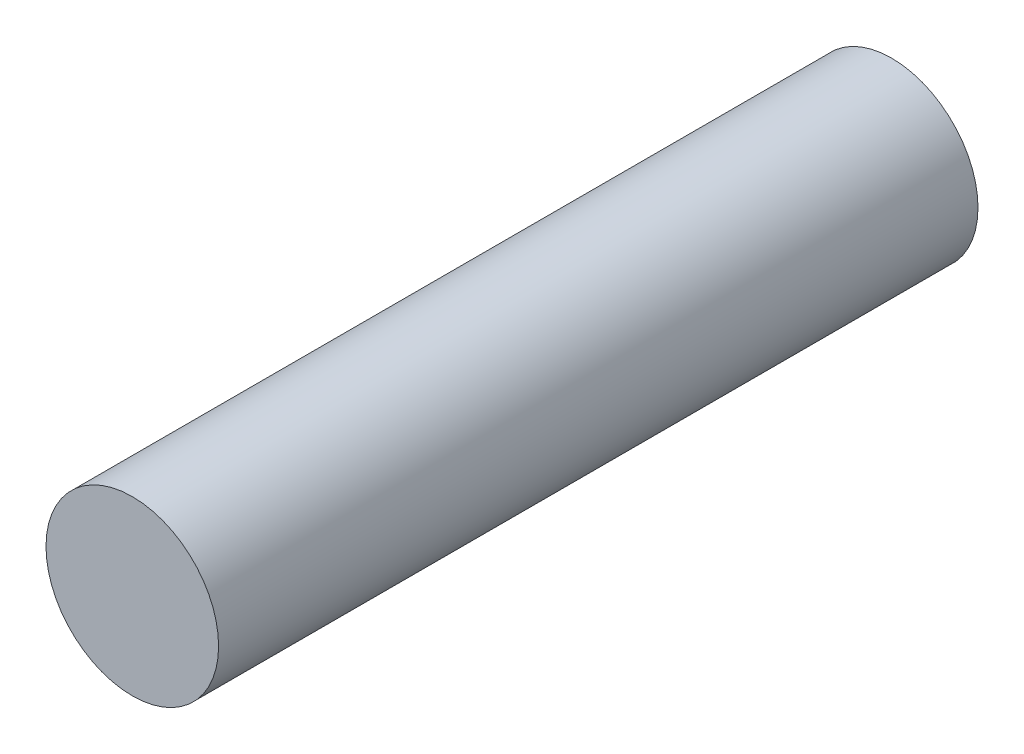
ISO-10303-21;
HEADER;
FILE_DESCRIPTION(('STEP AP214'),'2;1');
FILE_NAME('part.step','',(''),(''),'','','');
FILE_SCHEMA(('AUTOMOTIVE_DESIGN { 1 0 10303 214 1 1 1 1 }'));
ENDSEC;
DATA;
#1=APPLICATION_CONTEXT('core data for automotive mechanical design processes');
#2=APPLICATION_PROTOCOL_DEFINITION('international standard','automotive_design',2000,#1);
#3=PRODUCT_CONTEXT('',#1,'mechanical');
#4=PRODUCT('Part','Part','',(#3));
#5=PRODUCT_RELATED_PRODUCT_CATEGORY('part','',(#4));
#6=PRODUCT_DEFINITION_FORMATION('','',#4);
#7=PRODUCT_DEFINITION_CONTEXT('part definition',#1,'design');
#8=PRODUCT_DEFINITION('design','',#6,#7);
#9=PRODUCT_DEFINITION_SHAPE('','',#8);
#10=(LENGTH_UNIT() NAMED_UNIT(*) SI_UNIT(.MILLI.,.METRE.));
#11=(NAMED_UNIT(*) PLANE_ANGLE_UNIT() SI_UNIT($,.RADIAN.));
#12=(NAMED_UNIT(*) SI_UNIT($,.STERADIAN.) SOLID_ANGLE_UNIT());
#13=UNCERTAINTY_MEASURE_WITH_UNIT(LENGTH_MEASURE(1.E-05),#10,'distance_accuracy_value','');
#14=(GEOMETRIC_REPRESENTATION_CONTEXT(3) GLOBAL_UNCERTAINTY_ASSIGNED_CONTEXT((#13)) GLOBAL_UNIT_ASSIGNED_CONTEXT((#10,
#11,#12)) REPRESENTATION_CONTEXT('',''));
#15=CARTESIAN_POINT('',(0.,0.,0.));
#16=DIRECTION('',(0.,0.,1.));
#17=DIRECTION('',(1.,0.,0.));
#18=AXIS2_PLACEMENT_3D('',#15,#16,#17);
#19=CARTESIAN_POINT('',(0.,0.,22.));
#20=DIRECTION('',(0.,0.,-1.));
#21=DIRECTION('',(-1.,0.,0.));
#22=AXIS2_PLACEMENT_3D('',#19,#20,#21);
#23=CYLINDRICAL_SURFACE('',#22,2.5);
#24=CARTESIAN_POINT('',(0.,0.,22.));
#25=DIRECTION('',(0.,0.,1.));
#26=DIRECTION('',(1.,0.,0.));
#27=AXIS2_PLACEMENT_3D('',#24,#25,#26);
#28=CIRCLE('',#27,2.5);
#29=CARTESIAN_POINT('',(2.5,0.,22.));
#30=VERTEX_POINT('',#29);
#31=EDGE_CURVE('E10',#30,#30,#28,.T.);
#32=ORIENTED_EDGE('',*,*,#31,.F.);
#33=EDGE_LOOP('',(#32));
#34=FACE_BOUND('',#33,.T.);
#35=CARTESIAN_POINT('',(0.,0.,0.));
#36=DIRECTION('',(0.,0.,1.));
#37=DIRECTION('',(1.,0.,0.));
#38=AXIS2_PLACEMENT_3D('',#35,#36,#37);
#39=CIRCLE('',#38,2.5);
#40=CARTESIAN_POINT('',(2.5,0.,0.));
#41=VERTEX_POINT('',#40);
#42=EDGE_CURVE('E33',#41,#41,#39,.T.);
#43=ORIENTED_EDGE('',*,*,#42,.T.);
#44=EDGE_LOOP('',(#43));
#45=FACE_BOUND('',#44,.T.);
#46=ADVANCED_FACE('F30',(#34,#45),#23,.T.);
#47=CARTESIAN_POINT('',(0.,0.,22.));
#48=DIRECTION('',(0.,0.,1.));
#49=DIRECTION('',(1.,0.,0.));
#50=AXIS2_PLACEMENT_3D('',#47,#48,#49);
#51=PLANE('',#50);
#52=ORIENTED_EDGE('',*,*,#31,.T.);
#53=EDGE_LOOP('',(#52));
#54=FACE_BOUND('',#53,.T.);
#55=ADVANCED_FACE('F45',(#54),#51,.T.);
#56=CARTESIAN_POINT('',(0.,0.,0.));
#57=DIRECTION('',(0.,0.,1.));
#58=DIRECTION('',(1.,0.,0.));
#59=AXIS2_PLACEMENT_3D('',#56,#57,#58);
#60=PLANE('',#59);
#61=ORIENTED_EDGE('',*,*,#42,.F.);
#62=EDGE_LOOP('',(#61));
#63=FACE_BOUND('',#62,.T.);
#64=ADVANCED_FACE('F43',(#63),#60,.F.);
#65=CLOSED_SHELL('',(#46,#55,#64));
#66=MANIFOLD_SOLID_BREP('B2',#65);
#67=ADVANCED_BREP_SHAPE_REPRESENTATION('',(#18,#66),#14);
#68=SHAPE_DEFINITION_REPRESENTATION(#9,#67);
ENDSEC;
END-ISO-10303-21;
